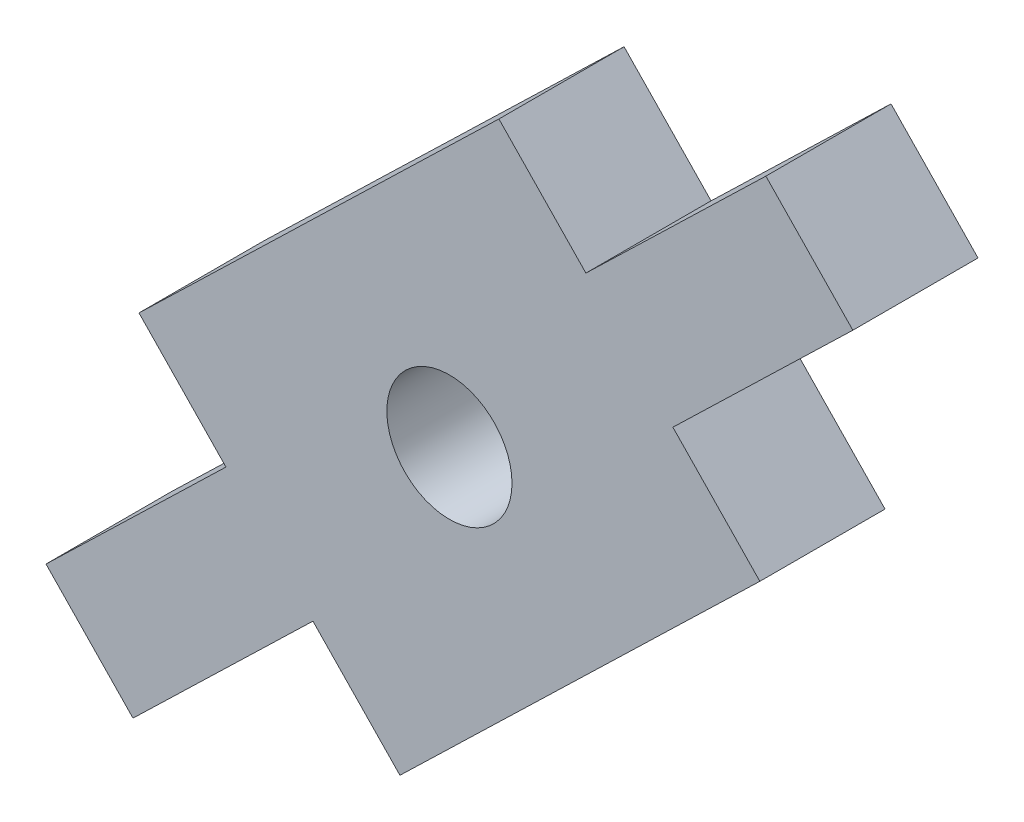
ISO-10303-21;
HEADER;
FILE_DESCRIPTION(('STEP AP214'),'2;1');
FILE_NAME('part.step','',(''),(''),'','','');
FILE_SCHEMA(('AUTOMOTIVE_DESIGN { 1 0 10303 214 1 1 1 1 }'));
ENDSEC;
DATA;
#1=APPLICATION_CONTEXT('core data for automotive mechanical design processes');
#2=APPLICATION_PROTOCOL_DEFINITION('international standard','automotive_design',2000,#1);
#3=PRODUCT_CONTEXT('',#1,'mechanical');
#4=PRODUCT('Part','Part','',(#3));
#5=PRODUCT_RELATED_PRODUCT_CATEGORY('part','',(#4));
#6=PRODUCT_DEFINITION_FORMATION('','',#4);
#7=PRODUCT_DEFINITION_CONTEXT('part definition',#1,'design');
#8=PRODUCT_DEFINITION('design','',#6,#7);
#9=PRODUCT_DEFINITION_SHAPE('','',#8);
#10=(LENGTH_UNIT() NAMED_UNIT(*) SI_UNIT(.MILLI.,.METRE.));
#11=(NAMED_UNIT(*) PLANE_ANGLE_UNIT() SI_UNIT($,.RADIAN.));
#12=(NAMED_UNIT(*) SI_UNIT($,.STERADIAN.) SOLID_ANGLE_UNIT());
#13=UNCERTAINTY_MEASURE_WITH_UNIT(LENGTH_MEASURE(1.E-05),#10,'distance_accuracy_value','');
#14=(GEOMETRIC_REPRESENTATION_CONTEXT(3) GLOBAL_UNCERTAINTY_ASSIGNED_CONTEXT((#13)) GLOBAL_UNIT_ASSIGNED_CONTEXT((#10,
#11,#12)) REPRESENTATION_CONTEXT('',''));
#15=CARTESIAN_POINT('',(0.,0.,0.));
#16=DIRECTION('',(0.,0.,1.));
#17=DIRECTION('',(1.,0.,0.));
#18=AXIS2_PLACEMENT_3D('',#15,#16,#17);
#19=CARTESIAN_POINT('',(0.,0.,3.));
#20=DIRECTION('',(0.,0.,-1.));
#21=DIRECTION('',(-1.,0.,0.));
#22=AXIS2_PLACEMENT_3D('',#19,#20,#21);
#23=PLANE('',#22);
#24=DIRECTION('',(0.695022096846116,-0.718988376050425,0.));
#25=VECTOR('',#24,1.);
#26=CARTESIAN_POINT('',(170.909019291665,-46.3001190654383,3.));
#27=LINE('',#26,#25);
#28=CARTESIAN_POINT('',(168.823953001125,-44.1431539372854,3.));
#29=VERTEX_POINT('',#28);
#30=CARTESIAN_POINT('',(170.909019291665,-46.3001190654383,3.));
#31=VERTEX_POINT('',#30);
#32=EDGE_CURVE('E181',#29,#31,#27,.T.);
#33=ORIENTED_EDGE('',*,*,#32,.T.);
#34=DIRECTION('',(-0.718988376050385,-0.695022096846158,0.));
#35=VECTOR('',#34,1.);
#36=CARTESIAN_POINT('',(166.595089035364,-50.470251646514,3.));
#37=LINE('',#36,#35);
#38=CARTESIAN_POINT('',(166.595089035364,-50.470251646514,3.));
#39=VERTEX_POINT('',#38);
#40=EDGE_CURVE('E109',#31,#39,#37,.T.);
#41=ORIENTED_EDGE('',*,*,#40,.T.);
#42=DIRECTION('',(0.695022096846121,-0.71898837605042,0.));
#43=VECTOR('',#42,1.);
#44=CARTESIAN_POINT('',(166.595089035364,-50.470251646514,3.));
#45=LINE('',#44,#43);
#46=CARTESIAN_POINT('',(168.680155325902,-52.6272167746652,3.));
#47=VERTEX_POINT('',#46);
#48=EDGE_CURVE('E208',#39,#47,#45,.T.);
#49=ORIENTED_EDGE('',*,*,#48,.T.);
#50=DIRECTION('',(0.718988376050391,0.695022096846152,0.));
#51=VECTOR('',#50,1.);
#52=CARTESIAN_POINT('',(168.680155325902,-52.6272167746652,3.));
#53=LINE('',#52,#51);
#54=CARTESIAN_POINT('',(172.994085582203,-48.4570841935896,3.));
#55=VERTEX_POINT('',#54);
#56=EDGE_CURVE('E227',#47,#55,#53,.T.);
#57=ORIENTED_EDGE('',*,*,#56,.T.);
#58=DIRECTION('',(0.695022096846118,-0.718988376050424,0.));
#59=VECTOR('',#58,1.);
#60=CARTESIAN_POINT('',(175.079151872742,-50.6140493217409,3.));
#61=LINE('',#60,#59);
#62=CARTESIAN_POINT('',(175.079151872742,-50.6140493217409,3.));
#63=VERTEX_POINT('',#62);
#64=EDGE_CURVE('E224',#55,#63,#61,.T.);
#65=ORIENTED_EDGE('',*,*,#64,.T.);
#66=DIRECTION('',(0.718988376050423,0.695022096846118,0.));
#67=VECTOR('',#66,1.);
#68=CARTESIAN_POINT('',(175.079151872742,-50.6140493217409,3.));
#69=LINE('',#68,#67);
#70=CARTESIAN_POINT('',(183.707012385347,-42.2737841595874,3.));
#71=VERTEX_POINT('',#70);
#72=EDGE_CURVE('E226',#63,#71,#69,.T.);
#73=ORIENTED_EDGE('',*,*,#72,.T.);
#74=DIRECTION('',(-0.695022096846117,0.718988376050425,0.));
#75=VECTOR('',#74,1.);
#76=CARTESIAN_POINT('',(183.707012385347,-42.2737841595874,3.));
#77=LINE('',#76,#75);
#78=CARTESIAN_POINT('',(181.621946094809,-40.1168190314361,3.));
#79=VERTEX_POINT('',#78);
#80=EDGE_CURVE('E229',#71,#79,#77,.T.);
#81=ORIENTED_EDGE('',*,*,#80,.T.);
#82=DIRECTION('',(0.718988376050463,0.695022096846078,0.));
#83=VECTOR('',#82,1.);
#84=CARTESIAN_POINT('',(181.621946094809,-40.1168190314361,3.));
#85=LINE('',#84,#83);
#86=CARTESIAN_POINT('',(185.935876351113,-35.9466864503584,3.));
#87=VERTEX_POINT('',#86);
#88=EDGE_CURVE('E235',#79,#87,#85,.T.);
#89=ORIENTED_EDGE('',*,*,#88,.T.);
#90=DIRECTION('',(-0.695022096846126,0.718988376050416,0.));
#91=VECTOR('',#90,1.);
#92=CARTESIAN_POINT('',(183.850810060574,-33.7897213222072,3.));
#93=LINE('',#92,#91);
#94=CARTESIAN_POINT('',(183.850810060574,-33.7897213222072,3.));
#95=VERTEX_POINT('',#94);
#96=EDGE_CURVE('E140',#87,#95,#93,.T.);
#97=ORIENTED_EDGE('',*,*,#96,.T.);
#98=DIRECTION('',(-0.718988376050423,-0.695022096846119,0.));
#99=VECTOR('',#98,1.);
#100=CARTESIAN_POINT('',(179.53687980427,-37.9598539032851,3.));
#101=LINE('',#100,#99);
#102=CARTESIAN_POINT('',(179.53687980427,-37.9598539032851,3.));
#103=VERTEX_POINT('',#102);
#104=EDGE_CURVE('E134',#95,#103,#101,.T.);
#105=ORIENTED_EDGE('',*,*,#104,.T.);
#106=DIRECTION('',(-0.695022096846117,0.718988376050424,0.));
#107=VECTOR('',#106,1.);
#108=CARTESIAN_POINT('',(179.53687980427,-37.9598539032851,3.));
#109=LINE('',#108,#107);
#110=CARTESIAN_POINT('',(177.451813513732,-35.8028887751334,3.));
#111=VERTEX_POINT('',#110);
#112=EDGE_CURVE('E138',#103,#111,#109,.T.);
#113=ORIENTED_EDGE('',*,*,#112,.T.);
#114=DIRECTION('',(-0.718988376050533,-0.695022096846005,0.));
#115=VECTOR('',#114,1.);
#116=CARTESIAN_POINT('',(168.823953001125,-44.1431539372854,3.));
#117=LINE('',#116,#115);
#118=EDGE_CURVE('E54',#111,#29,#117,.T.);
#119=ORIENTED_EDGE('',*,*,#118,.T.);
#120=EDGE_LOOP('',(#33,#41,#49,#57,#65,#73,#81,#89,#97,#105,#113,#119));
#121=FACE_BOUND('',#120,.T.);
#122=CARTESIAN_POINT('',(176.265482693238,-43.208469048436,3.));
#123=DIRECTION('',(0.,0.,1.));
#124=DIRECTION('',(1.,0.,0.));
#125=AXIS2_PLACEMENT_3D('',#122,#123,#124);
#126=CIRCLE('',#125,1.49999999999687);
#127=CARTESIAN_POINT('',(177.765482693235,-43.208469048436,3.));
#128=VERTEX_POINT('',#127);
#129=EDGE_CURVE('E162',#128,#128,#126,.T.);
#130=ORIENTED_EDGE('',*,*,#129,.F.);
#131=EDGE_LOOP('',(#130));
#132=FACE_BOUND('',#131,.T.);
#133=ADVANCED_FACE('F37',(#121,#132),#23,.F.);
#134=CARTESIAN_POINT('',(0.,0.,0.));
#135=DIRECTION('',(0.,0.,-1.));
#136=DIRECTION('',(-1.,0.,0.));
#137=AXIS2_PLACEMENT_3D('',#134,#135,#136);
#138=PLANE('',#137);
#139=DIRECTION('',(0.695022096846116,-0.718988376050425,0.));
#140=VECTOR('',#139,1.);
#141=CARTESIAN_POINT('',(170.909019291665,-46.3001190654383,0.));
#142=LINE('',#141,#140);
#143=CARTESIAN_POINT('',(168.823953001125,-44.1431539372854,0.));
#144=VERTEX_POINT('',#143);
#145=CARTESIAN_POINT('',(170.909019291665,-46.3001190654383,0.));
#146=VERTEX_POINT('',#145);
#147=EDGE_CURVE('E158',#144,#146,#142,.T.);
#148=ORIENTED_EDGE('',*,*,#147,.F.);
#149=DIRECTION('',(-0.718988376050533,-0.695022096846005,0.));
#150=VECTOR('',#149,1.);
#151=CARTESIAN_POINT('',(168.823953001125,-44.1431539372854,0.));
#152=LINE('',#151,#150);
#153=CARTESIAN_POINT('',(177.451813513732,-35.8028887751334,0.));
#154=VERTEX_POINT('',#153);
#155=EDGE_CURVE('E101',#154,#144,#152,.T.);
#156=ORIENTED_EDGE('',*,*,#155,.F.);
#157=DIRECTION('',(-0.695022096846117,0.718988376050424,0.));
#158=VECTOR('',#157,1.);
#159=CARTESIAN_POINT('',(179.53687980427,-37.9598539032851,0.));
#160=LINE('',#159,#158);
#161=CARTESIAN_POINT('',(179.53687980427,-37.9598539032851,0.));
#162=VERTEX_POINT('',#161);
#163=EDGE_CURVE('E95',#162,#154,#160,.T.);
#164=ORIENTED_EDGE('',*,*,#163,.F.);
#165=DIRECTION('',(-0.718988376050423,-0.695022096846119,0.));
#166=VECTOR('',#165,1.);
#167=CARTESIAN_POINT('',(179.53687980427,-37.9598539032851,0.));
#168=LINE('',#167,#166);
#169=CARTESIAN_POINT('',(183.850810060574,-33.7897213222072,0.));
#170=VERTEX_POINT('',#169);
#171=EDGE_CURVE('E148',#170,#162,#168,.T.);
#172=ORIENTED_EDGE('',*,*,#171,.F.);
#173=DIRECTION('',(-0.695022096846126,0.718988376050416,0.));
#174=VECTOR('',#173,1.);
#175=CARTESIAN_POINT('',(183.850810060574,-33.7897213222072,0.));
#176=LINE('',#175,#174);
#177=CARTESIAN_POINT('',(185.935876351113,-35.9466864503584,0.));
#178=VERTEX_POINT('',#177);
#179=EDGE_CURVE('E176',#178,#170,#176,.T.);
#180=ORIENTED_EDGE('',*,*,#179,.F.);
#181=DIRECTION('',(0.718988376050463,0.695022096846078,0.));
#182=VECTOR('',#181,1.);
#183=CARTESIAN_POINT('',(181.621946094809,-40.1168190314361,0.));
#184=LINE('',#183,#182);
#185=CARTESIAN_POINT('',(181.621946094809,-40.1168190314361,0.));
#186=VERTEX_POINT('',#185);
#187=EDGE_CURVE('E174',#186,#178,#184,.T.);
#188=ORIENTED_EDGE('',*,*,#187,.F.);
#189=DIRECTION('',(-0.695022096846117,0.718988376050425,0.));
#190=VECTOR('',#189,1.);
#191=CARTESIAN_POINT('',(183.707012385347,-42.2737841595874,0.));
#192=LINE('',#191,#190);
#193=CARTESIAN_POINT('',(183.707012385347,-42.2737841595874,0.));
#194=VERTEX_POINT('',#193);
#195=EDGE_CURVE('E172',#194,#186,#192,.T.);
#196=ORIENTED_EDGE('',*,*,#195,.F.);
#197=DIRECTION('',(0.718988376050423,0.695022096846118,0.));
#198=VECTOR('',#197,1.);
#199=CARTESIAN_POINT('',(175.079151872742,-50.6140493217409,0.));
#200=LINE('',#199,#198);
#201=CARTESIAN_POINT('',(175.079151872742,-50.6140493217409,0.));
#202=VERTEX_POINT('',#201);
#203=EDGE_CURVE('E170',#202,#194,#200,.T.);
#204=ORIENTED_EDGE('',*,*,#203,.F.);
#205=DIRECTION('',(0.695022096846118,-0.718988376050424,0.));
#206=VECTOR('',#205,1.);
#207=CARTESIAN_POINT('',(175.079151872742,-50.6140493217409,0.));
#208=LINE('',#207,#206);
#209=CARTESIAN_POINT('',(172.994085582203,-48.4570841935896,0.));
#210=VERTEX_POINT('',#209);
#211=EDGE_CURVE('E168',#210,#202,#208,.T.);
#212=ORIENTED_EDGE('',*,*,#211,.F.);
#213=DIRECTION('',(0.718988376050391,0.695022096846152,0.));
#214=VECTOR('',#213,1.);
#215=CARTESIAN_POINT('',(168.680155325902,-52.6272167746652,0.));
#216=LINE('',#215,#214);
#217=CARTESIAN_POINT('',(168.680155325902,-52.6272167746652,0.));
#218=VERTEX_POINT('',#217);
#219=EDGE_CURVE('E166',#218,#210,#216,.T.);
#220=ORIENTED_EDGE('',*,*,#219,.F.);
#221=DIRECTION('',(0.695022096846121,-0.71898837605042,0.));
#222=VECTOR('',#221,1.);
#223=CARTESIAN_POINT('',(166.595089035364,-50.470251646514,0.));
#224=LINE('',#223,#222);
#225=CARTESIAN_POINT('',(166.595089035364,-50.470251646514,0.));
#226=VERTEX_POINT('',#225);
#227=EDGE_CURVE('E164',#226,#218,#224,.T.);
#228=ORIENTED_EDGE('',*,*,#227,.F.);
#229=DIRECTION('',(-0.718988376050385,-0.695022096846158,0.));
#230=VECTOR('',#229,1.);
#231=CARTESIAN_POINT('',(166.595089035364,-50.470251646514,0.));
#232=LINE('',#231,#230);
#233=EDGE_CURVE('E161',#146,#226,#232,.T.);
#234=ORIENTED_EDGE('',*,*,#233,.F.);
#235=EDGE_LOOP('',(#148,#156,#164,#172,#180,#188,#196,#204,#212,#220,#228,#234));
#236=FACE_BOUND('',#235,.T.);
#237=CARTESIAN_POINT('',(176.265482693238,-43.208469048436,0.));
#238=DIRECTION('',(0.,0.,1.));
#239=DIRECTION('',(1.,0.,0.));
#240=AXIS2_PLACEMENT_3D('',#237,#238,#239);
#241=CIRCLE('',#240,1.49999999999687);
#242=CARTESIAN_POINT('',(177.765482693235,-43.208469048436,0.));
#243=VERTEX_POINT('',#242);
#244=EDGE_CURVE('E382',#243,#243,#241,.T.);
#245=ORIENTED_EDGE('',*,*,#244,.T.);
#246=EDGE_LOOP('',(#245));
#247=FACE_BOUND('',#246,.T.);
#248=ADVANCED_FACE('F212',(#236,#247),#138,.T.);
#249=CARTESIAN_POINT('',(170.909019291665,-46.3001190654383,3.));
#250=DIRECTION('',(0.718988376050425,0.695022096846116,0.));
#251=DIRECTION('',(-0.695022096846116,0.718988376050425,0.));
#252=AXIS2_PLACEMENT_3D('',#249,#250,#251);
#253=PLANE('',#252);
#254=ORIENTED_EDGE('',*,*,#147,.T.);
#255=DIRECTION('',(0.,0.,-1.));
#256=VECTOR('',#255,1.);
#257=CARTESIAN_POINT('',(170.909019291665,-46.3001190654383,3.));
#258=LINE('',#257,#256);
#259=EDGE_CURVE('E11',#31,#146,#258,.T.);
#260=ORIENTED_EDGE('',*,*,#259,.F.);
#261=ORIENTED_EDGE('',*,*,#32,.F.);
#262=DIRECTION('',(0.,0.,-1.));
#263=VECTOR('',#262,1.);
#264=CARTESIAN_POINT('',(168.823953001125,-44.1431539372854,3.));
#265=LINE('',#264,#263);
#266=EDGE_CURVE('E154',#29,#144,#265,.T.);
#267=ORIENTED_EDGE('',*,*,#266,.T.);
#268=EDGE_LOOP('',(#254,#260,#261,#267));
#269=FACE_BOUND('',#268,.T.);
#270=ADVANCED_FACE('F39',(#269),#253,.F.);
#271=CARTESIAN_POINT('',(166.595089035364,-50.470251646514,3.));
#272=DIRECTION('',(0.695022096846158,-0.718988376050385,0.));
#273=DIRECTION('',(0.718988376050385,0.695022096846158,0.));
#274=AXIS2_PLACEMENT_3D('',#271,#272,#273);
#275=PLANE('',#274);
#276=ORIENTED_EDGE('',*,*,#233,.T.);
#277=DIRECTION('',(0.,0.,-1.));
#278=VECTOR('',#277,1.);
#279=CARTESIAN_POINT('',(166.595089035364,-50.470251646514,3.));
#280=LINE('',#279,#278);
#281=EDGE_CURVE('E46',#39,#226,#280,.T.);
#282=ORIENTED_EDGE('',*,*,#281,.F.);
#283=ORIENTED_EDGE('',*,*,#40,.F.);
#284=ORIENTED_EDGE('',*,*,#259,.T.);
#285=EDGE_LOOP('',(#276,#282,#283,#284));
#286=FACE_BOUND('',#285,.T.);
#287=ADVANCED_FACE('F269',(#286),#275,.F.);
#288=CARTESIAN_POINT('',(166.595089035364,-50.470251646514,3.));
#289=DIRECTION('',(0.71898837605042,0.695022096846121,0.));
#290=DIRECTION('',(-0.695022096846121,0.71898837605042,0.));
#291=AXIS2_PLACEMENT_3D('',#288,#289,#290);
#292=PLANE('',#291);
#293=ORIENTED_EDGE('',*,*,#227,.T.);
#294=DIRECTION('',(0.,0.,-1.));
#295=VECTOR('',#294,1.);
#296=CARTESIAN_POINT('',(168.680155325902,-52.6272167746652,3.));
#297=LINE('',#296,#295);
#298=EDGE_CURVE('E200',#47,#218,#297,.T.);
#299=ORIENTED_EDGE('',*,*,#298,.F.);
#300=ORIENTED_EDGE('',*,*,#48,.F.);
#301=ORIENTED_EDGE('',*,*,#281,.T.);
#302=EDGE_LOOP('',(#293,#299,#300,#301));
#303=FACE_BOUND('',#302,.T.);
#304=ADVANCED_FACE('F206',(#303),#292,.F.);
#305=CARTESIAN_POINT('',(168.680155325902,-52.6272167746652,3.));
#306=DIRECTION('',(-0.695022096846152,0.718988376050391,0.));
#307=DIRECTION('',(-0.718988376050391,-0.695022096846152,0.));
#308=AXIS2_PLACEMENT_3D('',#305,#306,#307);
#309=PLANE('',#308);
#310=ORIENTED_EDGE('',*,*,#219,.T.);
#311=DIRECTION('',(0.,0.,-1.));
#312=VECTOR('',#311,1.);
#313=CARTESIAN_POINT('',(172.994085582203,-48.4570841935896,3.));
#314=LINE('',#313,#312);
#315=EDGE_CURVE('E197',#55,#210,#314,.T.);
#316=ORIENTED_EDGE('',*,*,#315,.F.);
#317=ORIENTED_EDGE('',*,*,#56,.F.);
#318=ORIENTED_EDGE('',*,*,#298,.T.);
#319=EDGE_LOOP('',(#310,#316,#317,#318));
#320=FACE_BOUND('',#319,.T.);
#321=ADVANCED_FACE('F218',(#320),#309,.F.);
#322=CARTESIAN_POINT('',(175.079151872742,-50.6140493217409,3.));
#323=DIRECTION('',(0.718988376050424,0.695022096846118,0.));
#324=DIRECTION('',(-0.695022096846118,0.718988376050424,0.));
#325=AXIS2_PLACEMENT_3D('',#322,#323,#324);
#326=PLANE('',#325);
#327=ORIENTED_EDGE('',*,*,#211,.T.);
#328=DIRECTION('',(0.,0.,-1.));
#329=VECTOR('',#328,1.);
#330=CARTESIAN_POINT('',(175.079151872742,-50.6140493217409,3.));
#331=LINE('',#330,#329);
#332=EDGE_CURVE('E194',#63,#202,#331,.T.);
#333=ORIENTED_EDGE('',*,*,#332,.F.);
#334=ORIENTED_EDGE('',*,*,#64,.F.);
#335=ORIENTED_EDGE('',*,*,#315,.T.);
#336=EDGE_LOOP('',(#327,#333,#334,#335));
#337=FACE_BOUND('',#336,.T.);
#338=ADVANCED_FACE('F222',(#337),#326,.F.);
#339=CARTESIAN_POINT('',(175.079151872742,-50.6140493217409,3.));
#340=DIRECTION('',(-0.695022096846118,0.718988376050423,0.));
#341=DIRECTION('',(-0.718988376050424,-0.695022096846118,0.));
#342=AXIS2_PLACEMENT_3D('',#339,#340,#341);
#343=PLANE('',#342);
#344=ORIENTED_EDGE('',*,*,#203,.T.);
#345=DIRECTION('',(0.,0.,-1.));
#346=VECTOR('',#345,1.);
#347=CARTESIAN_POINT('',(183.707012385347,-42.2737841595874,3.));
#348=LINE('',#347,#346);
#349=EDGE_CURVE('E191',#71,#194,#348,.T.);
#350=ORIENTED_EDGE('',*,*,#349,.F.);
#351=ORIENTED_EDGE('',*,*,#72,.F.);
#352=ORIENTED_EDGE('',*,*,#332,.T.);
#353=EDGE_LOOP('',(#344,#350,#351,#352));
#354=FACE_BOUND('',#353,.T.);
#355=ADVANCED_FACE('F282',(#354),#343,.F.);
#356=CARTESIAN_POINT('',(183.707012385347,-42.2737841595874,3.));
#357=DIRECTION('',(-0.718988376050425,-0.695022096846117,0.));
#358=DIRECTION('',(0.695022096846117,-0.718988376050425,0.));
#359=AXIS2_PLACEMENT_3D('',#356,#357,#358);
#360=PLANE('',#359);
#361=ORIENTED_EDGE('',*,*,#195,.T.);
#362=DIRECTION('',(0.,0.,-1.));
#363=VECTOR('',#362,1.);
#364=CARTESIAN_POINT('',(181.621946094809,-40.1168190314361,3.));
#365=LINE('',#364,#363);
#366=EDGE_CURVE('E188',#79,#186,#365,.T.);
#367=ORIENTED_EDGE('',*,*,#366,.F.);
#368=ORIENTED_EDGE('',*,*,#80,.F.);
#369=ORIENTED_EDGE('',*,*,#349,.T.);
#370=EDGE_LOOP('',(#361,#367,#368,#369));
#371=FACE_BOUND('',#370,.T.);
#372=ADVANCED_FACE('F285',(#371),#360,.F.);
#373=CARTESIAN_POINT('',(181.621946094809,-40.1168190314361,3.));
#374=DIRECTION('',(-0.695022096846077,0.718988376050463,0.));
#375=DIRECTION('',(-0.718988376050463,-0.695022096846078,0.));
#376=AXIS2_PLACEMENT_3D('',#373,#374,#375);
#377=PLANE('',#376);
#378=ORIENTED_EDGE('',*,*,#187,.T.);
#379=DIRECTION('',(0.,0.,-1.));
#380=VECTOR('',#379,1.);
#381=CARTESIAN_POINT('',(185.935876351113,-35.9466864503584,3.));
#382=LINE('',#381,#380);
#383=EDGE_CURVE('E185',#87,#178,#382,.T.);
#384=ORIENTED_EDGE('',*,*,#383,.F.);
#385=ORIENTED_EDGE('',*,*,#88,.F.);
#386=ORIENTED_EDGE('',*,*,#366,.T.);
#387=EDGE_LOOP('',(#378,#384,#385,#386));
#388=FACE_BOUND('',#387,.T.);
#389=ADVANCED_FACE('F241',(#388),#377,.F.);
#390=CARTESIAN_POINT('',(183.850810060574,-33.7897213222072,3.));
#391=DIRECTION('',(-0.718988376050416,-0.695022096846126,0.));
#392=DIRECTION('',(0.695022096846126,-0.718988376050416,0.));
#393=AXIS2_PLACEMENT_3D('',#390,#391,#392);
#394=PLANE('',#393);
#395=ORIENTED_EDGE('',*,*,#179,.T.);
#396=DIRECTION('',(0.,0.,-1.));
#397=VECTOR('',#396,1.);
#398=CARTESIAN_POINT('',(183.850810060574,-33.7897213222072,3.));
#399=LINE('',#398,#397);
#400=EDGE_CURVE('E149',#95,#170,#399,.T.);
#401=ORIENTED_EDGE('',*,*,#400,.F.);
#402=ORIENTED_EDGE('',*,*,#96,.F.);
#403=ORIENTED_EDGE('',*,*,#383,.T.);
#404=EDGE_LOOP('',(#395,#401,#402,#403));
#405=FACE_BOUND('',#404,.T.);
#406=ADVANCED_FACE('F245',(#405),#394,.F.);
#407=CARTESIAN_POINT('',(179.53687980427,-37.9598539032851,3.));
#408=DIRECTION('',(0.695022096846119,-0.718988376050423,0.));
#409=DIRECTION('',(0.718988376050423,0.695022096846119,0.));
#410=AXIS2_PLACEMENT_3D('',#407,#408,#409);
#411=PLANE('',#410);
#412=ORIENTED_EDGE('',*,*,#171,.T.);
#413=DIRECTION('',(0.,0.,-1.));
#414=VECTOR('',#413,1.);
#415=CARTESIAN_POINT('',(179.53687980427,-37.9598539032851,3.));
#416=LINE('',#415,#414);
#417=EDGE_CURVE('E145',#103,#162,#416,.T.);
#418=ORIENTED_EDGE('',*,*,#417,.F.);
#419=ORIENTED_EDGE('',*,*,#104,.F.);
#420=ORIENTED_EDGE('',*,*,#400,.T.);
#421=EDGE_LOOP('',(#412,#418,#419,#420));
#422=FACE_BOUND('',#421,.T.);
#423=ADVANCED_FACE('F146',(#422),#411,.F.);
#424=CARTESIAN_POINT('',(179.53687980427,-37.9598539032851,3.));
#425=DIRECTION('',(-0.718988376050425,-0.695022096846117,0.));
#426=DIRECTION('',(0.695022096846117,-0.718988376050425,0.));
#427=AXIS2_PLACEMENT_3D('',#424,#425,#426);
#428=PLANE('',#427);
#429=ORIENTED_EDGE('',*,*,#163,.T.);
#430=DIRECTION('',(0.,0.,-1.));
#431=VECTOR('',#430,1.);
#432=CARTESIAN_POINT('',(177.451813513732,-35.8028887751334,3.));
#433=LINE('',#432,#431);
#434=EDGE_CURVE('E150',#111,#154,#433,.T.);
#435=ORIENTED_EDGE('',*,*,#434,.F.);
#436=ORIENTED_EDGE('',*,*,#112,.F.);
#437=ORIENTED_EDGE('',*,*,#417,.T.);
#438=EDGE_LOOP('',(#429,#435,#436,#437));
#439=FACE_BOUND('',#438,.T.);
#440=ADVANCED_FACE('F152',(#439),#428,.F.);
#441=CARTESIAN_POINT('',(168.823953001125,-44.1431539372854,3.));
#442=DIRECTION('',(0.695022096846005,-0.718988376050533,0.));
#443=DIRECTION('',(0.718988376050533,0.695022096846005,0.));
#444=AXIS2_PLACEMENT_3D('',#441,#442,#443);
#445=PLANE('',#444);
#446=ORIENTED_EDGE('',*,*,#155,.T.);
#447=ORIENTED_EDGE('',*,*,#266,.F.);
#448=ORIENTED_EDGE('',*,*,#118,.F.);
#449=ORIENTED_EDGE('',*,*,#434,.T.);
#450=EDGE_LOOP('',(#446,#447,#448,#449));
#451=FACE_BOUND('',#450,.T.);
#452=ADVANCED_FACE('F249',(#451),#445,.F.);
#453=CARTESIAN_POINT('',(176.265482693238,-43.208469048436,3.));
#454=DIRECTION('',(0.,0.,-1.));
#455=DIRECTION('',(-1.,0.,0.));
#456=AXIS2_PLACEMENT_3D('',#453,#454,#455);
#457=CYLINDRICAL_SURFACE('',#456,1.49999999999687);
#458=ORIENTED_EDGE('',*,*,#129,.T.);
#459=EDGE_LOOP('',(#458));
#460=FACE_BOUND('',#459,.T.);
#461=ORIENTED_EDGE('',*,*,#244,.F.);
#462=EDGE_LOOP('',(#461));
#463=FACE_BOUND('',#462,.T.);
#464=ADVANCED_FACE('F251',(#460,#463),#457,.F.);
#465=CLOSED_SHELL('',(#133,#248,#270,#287,#304,#321,#338,#355,#372,#389,#406,#423,#440,#452,#464));
#466=MANIFOLD_SOLID_BREP('B2',#465);
#467=ADVANCED_BREP_SHAPE_REPRESENTATION('',(#18,#466),#14);
#468=SHAPE_DEFINITION_REPRESENTATION(#9,#467);
ENDSEC;
END-ISO-10303-21;
